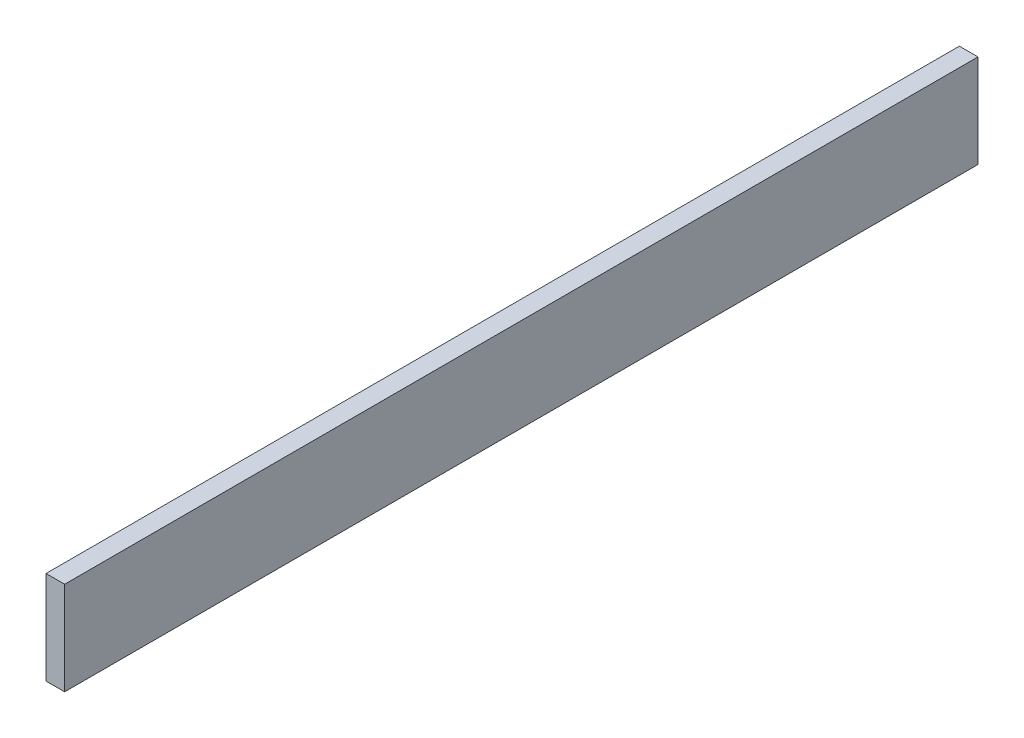
ISO-10303-21;
HEADER;
FILE_DESCRIPTION(('STEP AP214'),'2;1');
FILE_NAME('part.step','',(''),(''),'','','');
FILE_SCHEMA(('AUTOMOTIVE_DESIGN { 1 0 10303 214 1 1 1 1 }'));
ENDSEC;
DATA;
#1=APPLICATION_CONTEXT('core data for automotive mechanical design processes');
#2=APPLICATION_PROTOCOL_DEFINITION('international standard','automotive_design',2000,#1);
#3=PRODUCT_CONTEXT('',#1,'mechanical');
#4=PRODUCT('Part','Part','',(#3));
#5=PRODUCT_RELATED_PRODUCT_CATEGORY('part','',(#4));
#6=PRODUCT_DEFINITION_FORMATION('','',#4);
#7=PRODUCT_DEFINITION_CONTEXT('part definition',#1,'design');
#8=PRODUCT_DEFINITION('design','',#6,#7);
#9=PRODUCT_DEFINITION_SHAPE('','',#8);
#10=(LENGTH_UNIT() NAMED_UNIT(*) SI_UNIT(.MILLI.,.METRE.));
#11=(NAMED_UNIT(*) PLANE_ANGLE_UNIT() SI_UNIT($,.RADIAN.));
#12=(NAMED_UNIT(*) SI_UNIT($,.STERADIAN.) SOLID_ANGLE_UNIT());
#13=UNCERTAINTY_MEASURE_WITH_UNIT(LENGTH_MEASURE(1.E-05),#10,'distance_accuracy_value','');
#14=(GEOMETRIC_REPRESENTATION_CONTEXT(3) GLOBAL_UNCERTAINTY_ASSIGNED_CONTEXT((#13)) GLOBAL_UNIT_ASSIGNED_CONTEXT((#10,
#11,#12)) REPRESENTATION_CONTEXT('',''));
#15=CARTESIAN_POINT('',(0.,0.,0.));
#16=DIRECTION('',(0.,0.,1.));
#17=DIRECTION('',(1.,0.,0.));
#18=AXIS2_PLACEMENT_3D('',#15,#16,#17);
#19=CARTESIAN_POINT('',(12.7,0.,0.));
#20=DIRECTION('',(0.,0.,-1.));
#21=DIRECTION('',(-1.,0.,0.));
#22=AXIS2_PLACEMENT_3D('',#19,#20,#21);
#23=PLANE('',#22);
#24=DIRECTION('',(0.,-1.,0.));
#25=VECTOR('',#24,1.);
#26=CARTESIAN_POINT('',(0.,0.,0.));
#27=LINE('',#26,#25);
#28=CARTESIAN_POINT('',(0.,63.5,0.));
#29=VERTEX_POINT('',#28);
#30=CARTESIAN_POINT('',(0.,0.,0.));
#31=VERTEX_POINT('',#30);
#32=EDGE_CURVE('E107',#29,#31,#27,.T.);
#33=ORIENTED_EDGE('',*,*,#32,.T.);
#34=DIRECTION('',(-1.,0.,0.));
#35=VECTOR('',#34,1.);
#36=CARTESIAN_POINT('',(12.7,0.,0.));
#37=LINE('',#36,#35);
#38=CARTESIAN_POINT('',(12.7,0.,0.));
#39=VERTEX_POINT('',#38);
#40=EDGE_CURVE('E11',#39,#31,#37,.T.);
#41=ORIENTED_EDGE('',*,*,#40,.F.);
#42=DIRECTION('',(0.,-1.,0.));
#43=VECTOR('',#42,1.);
#44=CARTESIAN_POINT('',(12.7,0.,0.));
#45=LINE('',#44,#43);
#46=CARTESIAN_POINT('',(12.7,63.5,0.));
#47=VERTEX_POINT('',#46);
#48=EDGE_CURVE('E91',#47,#39,#45,.T.);
#49=ORIENTED_EDGE('',*,*,#48,.F.);
#50=DIRECTION('',(-1.,0.,0.));
#51=VECTOR('',#50,1.);
#52=CARTESIAN_POINT('',(12.7,63.5,0.));
#53=LINE('',#52,#51);
#54=EDGE_CURVE('E103',#47,#29,#53,.T.);
#55=ORIENTED_EDGE('',*,*,#54,.T.);
#56=EDGE_LOOP('',(#33,#41,#49,#55));
#57=FACE_BOUND('',#56,.T.);
#58=ADVANCED_FACE('F39',(#57),#23,.F.);
#59=CARTESIAN_POINT('',(12.7,0.,0.));
#60=DIRECTION('',(0.,1.,0.));
#61=DIRECTION('',(0.,0.,1.));
#62=AXIS2_PLACEMENT_3D('',#59,#60,#61);
#63=PLANE('',#62);
#64=DIRECTION('',(0.,0.,-1.));
#65=VECTOR('',#64,1.);
#66=CARTESIAN_POINT('',(0.,0.,0.));
#67=LINE('',#66,#65);
#68=CARTESIAN_POINT('',(0.,0.,-622.3));
#69=VERTEX_POINT('',#68);
#70=EDGE_CURVE('E96',#31,#69,#67,.T.);
#71=ORIENTED_EDGE('',*,*,#70,.T.);
#72=DIRECTION('',(-1.,0.,0.));
#73=VECTOR('',#72,1.);
#74=CARTESIAN_POINT('',(12.7,0.,-622.3));
#75=LINE('',#74,#73);
#76=CARTESIAN_POINT('',(12.7,0.,-622.3));
#77=VERTEX_POINT('',#76);
#78=EDGE_CURVE('E48',#77,#69,#75,.T.);
#79=ORIENTED_EDGE('',*,*,#78,.F.);
#80=DIRECTION('',(0.,0.,-1.));
#81=VECTOR('',#80,1.);
#82=CARTESIAN_POINT('',(12.7,0.,0.));
#83=LINE('',#82,#81);
#84=EDGE_CURVE('E86',#39,#77,#83,.T.);
#85=ORIENTED_EDGE('',*,*,#84,.F.);
#86=ORIENTED_EDGE('',*,*,#40,.T.);
#87=EDGE_LOOP('',(#71,#79,#85,#86));
#88=FACE_BOUND('',#87,.T.);
#89=ADVANCED_FACE('F95',(#88),#63,.F.);
#90=CARTESIAN_POINT('',(12.7,0.,-622.3));
#91=DIRECTION('',(0.,0.,1.));
#92=DIRECTION('',(1.,0.,0.));
#93=AXIS2_PLACEMENT_3D('',#90,#91,#92);
#94=PLANE('',#93);
#95=DIRECTION('',(0.,1.,0.));
#96=VECTOR('',#95,1.);
#97=CARTESIAN_POINT('',(0.,0.,-622.3));
#98=LINE('',#97,#96);
#99=CARTESIAN_POINT('',(0.,63.5,-622.3));
#100=VERTEX_POINT('',#99);
#101=EDGE_CURVE('E73',#69,#100,#98,.T.);
#102=ORIENTED_EDGE('',*,*,#101,.T.);
#103=DIRECTION('',(-1.,0.,0.));
#104=VECTOR('',#103,1.);
#105=CARTESIAN_POINT('',(12.7,63.5,-622.3));
#106=LINE('',#105,#104);
#107=CARTESIAN_POINT('',(12.7,63.5,-622.3));
#108=VERTEX_POINT('',#107);
#109=EDGE_CURVE('E98',#108,#100,#106,.T.);
#110=ORIENTED_EDGE('',*,*,#109,.F.);
#111=DIRECTION('',(0.,1.,0.));
#112=VECTOR('',#111,1.);
#113=CARTESIAN_POINT('',(12.7,0.,-622.3));
#114=LINE('',#113,#112);
#115=EDGE_CURVE('E89',#77,#108,#114,.T.);
#116=ORIENTED_EDGE('',*,*,#115,.F.);
#117=ORIENTED_EDGE('',*,*,#78,.T.);
#118=EDGE_LOOP('',(#102,#110,#116,#117));
#119=FACE_BOUND('',#118,.T.);
#120=ADVANCED_FACE('F99',(#119),#94,.F.);
#121=CARTESIAN_POINT('',(12.7,63.5,0.));
#122=DIRECTION('',(0.,-1.,0.));
#123=DIRECTION('',(0.,0.,-1.));
#124=AXIS2_PLACEMENT_3D('',#121,#122,#123);
#125=PLANE('',#124);
#126=DIRECTION('',(0.,0.,1.));
#127=VECTOR('',#126,1.);
#128=CARTESIAN_POINT('',(0.,63.5,0.));
#129=LINE('',#128,#127);
#130=EDGE_CURVE('E79',#100,#29,#129,.T.);
#131=ORIENTED_EDGE('',*,*,#130,.T.);
#132=ORIENTED_EDGE('',*,*,#54,.F.);
#133=DIRECTION('',(0.,0.,1.));
#134=VECTOR('',#133,1.);
#135=CARTESIAN_POINT('',(12.7,63.5,0.));
#136=LINE('',#135,#134);
#137=EDGE_CURVE('E56',#108,#47,#136,.T.);
#138=ORIENTED_EDGE('',*,*,#137,.F.);
#139=ORIENTED_EDGE('',*,*,#109,.T.);
#140=EDGE_LOOP('',(#131,#132,#138,#139));
#141=FACE_BOUND('',#140,.T.);
#142=ADVANCED_FACE('F120',(#141),#125,.F.);
#143=CARTESIAN_POINT('',(12.7,0.,0.));
#144=DIRECTION('',(-1.,0.,0.));
#145=DIRECTION('',(0.,0.,1.));
#146=AXIS2_PLACEMENT_3D('',#143,#144,#145);
#147=PLANE('',#146);
#148=ORIENTED_EDGE('',*,*,#48,.T.);
#149=ORIENTED_EDGE('',*,*,#84,.T.);
#150=ORIENTED_EDGE('',*,*,#115,.T.);
#151=ORIENTED_EDGE('',*,*,#137,.T.);
#152=EDGE_LOOP('',(#148,#149,#150,#151));
#153=FACE_BOUND('',#152,.T.);
#154=ADVANCED_FACE('F87',(#153),#147,.F.);
#155=CARTESIAN_POINT('',(0.,0.,0.));
#156=DIRECTION('',(-1.,0.,0.));
#157=DIRECTION('',(0.,0.,1.));
#158=AXIS2_PLACEMENT_3D('',#155,#156,#157);
#159=PLANE('',#158);
#160=ORIENTED_EDGE('',*,*,#32,.F.);
#161=ORIENTED_EDGE('',*,*,#130,.F.);
#162=ORIENTED_EDGE('',*,*,#101,.F.);
#163=ORIENTED_EDGE('',*,*,#70,.F.);
#164=EDGE_LOOP('',(#160,#161,#162,#163));
#165=FACE_BOUND('',#164,.T.);
#166=ADVANCED_FACE('F123',(#165),#159,.T.);
#167=CLOSED_SHELL('',(#58,#89,#120,#142,#154,#166));
#168=MANIFOLD_SOLID_BREP('B2',#167);
#169=ADVANCED_BREP_SHAPE_REPRESENTATION('',(#18,#168),#14);
#170=SHAPE_DEFINITION_REPRESENTATION(#9,#169);
ENDSEC;
END-ISO-10303-21;
